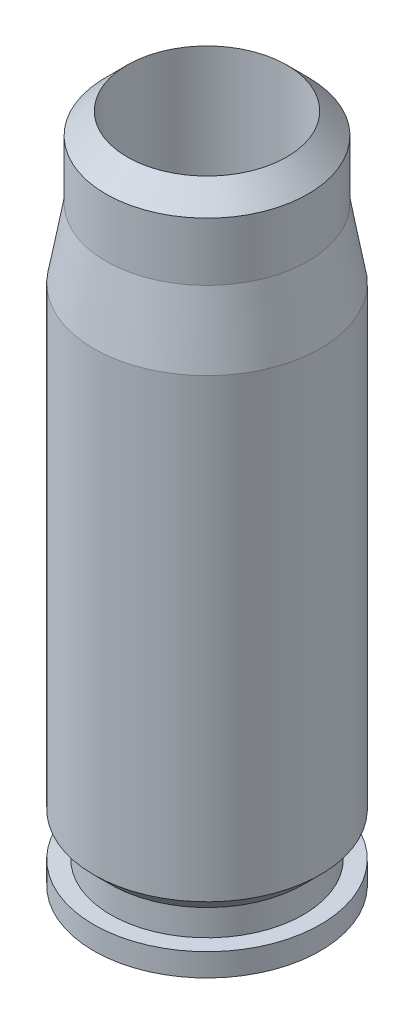
ISO-10303-21;
HEADER;
FILE_DESCRIPTION(('STEP AP214'),'2;1');
FILE_NAME('part.step','',(''),(''),'','','');
FILE_SCHEMA(('AUTOMOTIVE_DESIGN { 1 0 10303 214 1 1 1 1 }'));
ENDSEC;
DATA;
#1=APPLICATION_CONTEXT('core data for automotive mechanical design processes');
#2=APPLICATION_PROTOCOL_DEFINITION('international standard','automotive_design',2000,#1);
#3=PRODUCT_CONTEXT('',#1,'mechanical');
#4=PRODUCT('Part','Part','',(#3));
#5=PRODUCT_RELATED_PRODUCT_CATEGORY('part','',(#4));
#6=PRODUCT_DEFINITION_FORMATION('','',#4);
#7=PRODUCT_DEFINITION_CONTEXT('part definition',#1,'design');
#8=PRODUCT_DEFINITION('design','',#6,#7);
#9=PRODUCT_DEFINITION_SHAPE('','',#8);
#10=(LENGTH_UNIT() NAMED_UNIT(*) SI_UNIT(.MILLI.,.METRE.));
#11=(NAMED_UNIT(*) PLANE_ANGLE_UNIT() SI_UNIT($,.RADIAN.));
#12=(NAMED_UNIT(*) SI_UNIT($,.STERADIAN.) SOLID_ANGLE_UNIT());
#13=UNCERTAINTY_MEASURE_WITH_UNIT(LENGTH_MEASURE(1.E-05),#10,'distance_accuracy_value','');
#14=(GEOMETRIC_REPRESENTATION_CONTEXT(3) GLOBAL_UNCERTAINTY_ASSIGNED_CONTEXT((#13)) GLOBAL_UNIT_ASSIGNED_CONTEXT((#10,
#11,#12)) REPRESENTATION_CONTEXT('',''));
#15=CARTESIAN_POINT('',(0.,0.,0.));
#16=DIRECTION('',(0.,0.,1.));
#17=DIRECTION('',(1.,0.,0.));
#18=AXIS2_PLACEMENT_3D('',#15,#16,#17);
#19=CARTESIAN_POINT('',(0.,0.,0.));
#20=DIRECTION('',(0.,-1.,0.));
#21=DIRECTION('',(0.,0.,-1.));
#22=AXIS2_PLACEMENT_3D('',#19,#20,#21);
#23=CYLINDRICAL_SURFACE('',#22,4.5);
#24=CARTESIAN_POINT('',(0.,0.,0.));
#25=DIRECTION('',(0.,-1.,0.));
#26=DIRECTION('',(0.,0.,-1.));
#27=AXIS2_PLACEMENT_3D('',#24,#25,#26);
#28=CIRCLE('',#27,4.5);
#29=CARTESIAN_POINT('',(0.,0.,-4.5));
#30=VERTEX_POINT('',#29);
#31=EDGE_CURVE('E72',#30,#30,#28,.T.);
#32=ORIENTED_EDGE('',*,*,#31,.T.);
#33=EDGE_LOOP('',(#32));
#34=FACE_BOUND('',#33,.T.);
#35=CARTESIAN_POINT('',(0.,12.,0.));
#36=DIRECTION('',(0.,-1.,0.));
#37=DIRECTION('',(0.,0.,-1.));
#38=AXIS2_PLACEMENT_3D('',#35,#36,#37);
#39=CIRCLE('',#38,4.5);
#40=CARTESIAN_POINT('',(0.,12.,-4.5));
#41=VERTEX_POINT('',#40);
#42=EDGE_CURVE('E42',#41,#41,#39,.T.);
#43=ORIENTED_EDGE('',*,*,#42,.F.);
#44=EDGE_LOOP('',(#43));
#45=FACE_BOUND('',#44,.T.);
#46=ADVANCED_FACE('F31',(#34,#45),#23,.F.);
#47=CARTESIAN_POINT('',(0.,12.,-4.5));
#48=DIRECTION('',(0.,1.,0.));
#49=DIRECTION('',(0.,0.,1.));
#50=AXIS2_PLACEMENT_3D('',#47,#48,#49);
#51=PLANE('',#50);
#52=ORIENTED_EDGE('',*,*,#42,.T.);
#53=EDGE_LOOP('',(#52));
#54=FACE_BOUND('',#53,.T.);
#55=CARTESIAN_POINT('',(0.,12.,0.));
#56=DIRECTION('',(0.,-1.,0.));
#57=DIRECTION('',(0.,0.,-1.));
#58=AXIS2_PLACEMENT_3D('',#55,#56,#57);
#59=CIRCLE('',#58,7.00000000000001);
#60=CARTESIAN_POINT('',(0.,12.,-7.00000000000001));
#61=VERTEX_POINT('',#60);
#62=EDGE_CURVE('E46',#61,#61,#59,.T.);
#63=ORIENTED_EDGE('',*,*,#62,.F.);
#64=EDGE_LOOP('',(#63));
#65=FACE_BOUND('',#64,.T.);
#66=ADVANCED_FACE('F92',(#54,#65),#51,.T.);
#67=CARTESIAN_POINT('',(0.,0.,0.));
#68=DIRECTION('',(0.,-1.,0.));
#69=DIRECTION('',(0.,0.,-1.));
#70=AXIS2_PLACEMENT_3D('',#67,#68,#69);
#71=CYLINDRICAL_SURFACE('',#70,7.);
#72=CARTESIAN_POINT('',(0.,58.875,0.));
#73=DIRECTION('',(0.,-1.,0.));
#74=DIRECTION('',(0.,0.,-1.));
#75=AXIS2_PLACEMENT_3D('',#72,#73,#74);
#76=CIRCLE('',#75,7.);
#77=CARTESIAN_POINT('',(0.,58.875,-7.));
#78=VERTEX_POINT('',#77);
#79=EDGE_CURVE('E10',#78,#78,#76,.F.);
#80=ORIENTED_EDGE('',*,*,#79,.T.);
#81=EDGE_LOOP('',(#80));
#82=FACE_BOUND('',#81,.T.);
#83=ORIENTED_EDGE('',*,*,#62,.T.);
#84=EDGE_LOOP('',(#83));
#85=FACE_BOUND('',#84,.T.);
#86=ADVANCED_FACE('F96',(#82,#85),#71,.F.);
#87=CARTESIAN_POINT('',(0.,0.,0.));
#88=DIRECTION('',(0.,-1.,0.));
#89=DIRECTION('',(0.,0.,-1.));
#90=AXIS2_PLACEMENT_3D('',#87,#88,#89);
#91=CYLINDRICAL_SURFACE('',#90,8.875);
#92=CARTESIAN_POINT('',(0.,56.9999999999999,0.));
#93=DIRECTION('',(0.,1.,0.));
#94=DIRECTION('',(0.,0.,1.));
#95=AXIS2_PLACEMENT_3D('',#92,#93,#94);
#96=CIRCLE('',#95,8.875);
#97=CARTESIAN_POINT('',(0.,56.9999999999999,8.875));
#98=VERTEX_POINT('',#97);
#99=EDGE_CURVE('E38',#98,#98,#96,.F.);
#100=ORIENTED_EDGE('',*,*,#99,.T.);
#101=EDGE_LOOP('',(#100));
#102=FACE_BOUND('',#101,.T.);
#103=CARTESIAN_POINT('',(0.,51.8880146452539,0.));
#104=DIRECTION('',(0.,-1.,0.));
#105=DIRECTION('',(0.,0.,-1.));
#106=AXIS2_PLACEMENT_3D('',#103,#104,#105);
#107=CIRCLE('',#106,8.875);
#108=CARTESIAN_POINT('',(0.,51.8880146452539,-8.875));
#109=VERTEX_POINT('',#108);
#110=EDGE_CURVE('E51',#109,#109,#107,.T.);
#111=ORIENTED_EDGE('',*,*,#110,.F.);
#112=EDGE_LOOP('',(#111));
#113=FACE_BOUND('',#112,.T.);
#114=ADVANCED_FACE('F102',(#102,#113),#91,.T.);
#115=CARTESIAN_POINT('',(0.,45.7913866891649,0.));
#116=DIRECTION('',(0.,-1.,0.));
#117=DIRECTION('',(0.,0.,-1.));
#118=AXIS2_PLACEMENT_3D('',#115,#116,#117);
#119=CONICAL_SURFACE('',#118,9.95,0.174532925199434);
#120=ORIENTED_EDGE('',*,*,#110,.T.);
#121=EDGE_LOOP('',(#120));
#122=FACE_BOUND('',#121,.T.);
#123=CARTESIAN_POINT('',(0.,45.7913866891649,0.));
#124=DIRECTION('',(0.,-1.,0.));
#125=DIRECTION('',(0.,0.,-1.));
#126=AXIS2_PLACEMENT_3D('',#123,#124,#125);
#127=CIRCLE('',#126,9.95);
#128=CARTESIAN_POINT('',(0.,45.7913866891649,-9.95));
#129=VERTEX_POINT('',#128);
#130=EDGE_CURVE('E54',#129,#129,#127,.T.);
#131=ORIENTED_EDGE('',*,*,#130,.F.);
#132=EDGE_LOOP('',(#131));
#133=FACE_BOUND('',#132,.T.);
#134=ADVANCED_FACE('F105',(#122,#133),#119,.T.);
#135=CARTESIAN_POINT('',(0.,0.,0.));
#136=DIRECTION('',(0.,-1.,0.));
#137=DIRECTION('',(0.,0.,-1.));
#138=AXIS2_PLACEMENT_3D('',#135,#136,#137);
#139=CYLINDRICAL_SURFACE('',#138,9.95);
#140=ORIENTED_EDGE('',*,*,#130,.T.);
#141=EDGE_LOOP('',(#140));
#142=FACE_BOUND('',#141,.T.);
#143=CARTESIAN_POINT('',(0.,5.79138668916486,0.));
#144=DIRECTION('',(0.,-1.,0.));
#145=DIRECTION('',(0.,0.,-1.));
#146=AXIS2_PLACEMENT_3D('',#143,#144,#145);
#147=CIRCLE('',#146,9.95);
#148=CARTESIAN_POINT('',(0.,5.79138668916486,-9.95));
#149=VERTEX_POINT('',#148);
#150=EDGE_CURVE('E57',#149,#149,#147,.T.);
#151=ORIENTED_EDGE('',*,*,#150,.F.);
#152=EDGE_LOOP('',(#151));
#153=FACE_BOUND('',#152,.T.);
#154=ADVANCED_FACE('F108',(#142,#153),#139,.T.);
#155=CARTESIAN_POINT('',(0.,4.3,0.));
#156=DIRECTION('',(0.,1.,0.));
#157=DIRECTION('',(0.,0.,1.));
#158=AXIS2_PLACEMENT_3D('',#155,#156,#157);
#159=CONICAL_SURFACE('',#158,8.45861331083515,0.785398163397447);
#160=ORIENTED_EDGE('',*,*,#150,.T.);
#161=EDGE_LOOP('',(#160));
#162=FACE_BOUND('',#161,.T.);
#163=CARTESIAN_POINT('',(0.,4.3,0.));
#164=DIRECTION('',(0.,-1.,0.));
#165=DIRECTION('',(0.,0.,-1.));
#166=AXIS2_PLACEMENT_3D('',#163,#164,#165);
#167=CIRCLE('',#166,8.45861331083515);
#168=CARTESIAN_POINT('',(0.,4.3,-8.45861331083515));
#169=VERTEX_POINT('',#168);
#170=EDGE_CURVE('E60',#169,#169,#167,.T.);
#171=ORIENTED_EDGE('',*,*,#170,.F.);
#172=EDGE_LOOP('',(#171));
#173=FACE_BOUND('',#172,.T.);
#174=ADVANCED_FACE('F112',(#162,#173),#159,.T.);
#175=CARTESIAN_POINT('',(0.,0.,0.));
#176=DIRECTION('',(0.,-1.,0.));
#177=DIRECTION('',(0.,0.,-1.));
#178=AXIS2_PLACEMENT_3D('',#175,#176,#177);
#179=CYLINDRICAL_SURFACE('',#178,8.45861331083515);
#180=ORIENTED_EDGE('',*,*,#170,.T.);
#181=EDGE_LOOP('',(#180));
#182=FACE_BOUND('',#181,.T.);
#183=CARTESIAN_POINT('',(0.,2.,0.));
#184=DIRECTION('',(0.,-1.,0.));
#185=DIRECTION('',(0.,0.,-1.));
#186=AXIS2_PLACEMENT_3D('',#183,#184,#185);
#187=CIRCLE('',#186,8.45861331083515);
#188=CARTESIAN_POINT('',(0.,2.,-8.45861331083515));
#189=VERTEX_POINT('',#188);
#190=EDGE_CURVE('E63',#189,#189,#187,.T.);
#191=ORIENTED_EDGE('',*,*,#190,.F.);
#192=EDGE_LOOP('',(#191));
#193=FACE_BOUND('',#192,.T.);
#194=ADVANCED_FACE('F116',(#182,#193),#179,.T.);
#195=CARTESIAN_POINT('',(0.,2.,-9.95));
#196=DIRECTION('',(0.,1.,0.));
#197=DIRECTION('',(0.,0.,1.));
#198=AXIS2_PLACEMENT_3D('',#195,#196,#197);
#199=PLANE('',#198);
#200=ORIENTED_EDGE('',*,*,#190,.T.);
#201=EDGE_LOOP('',(#200));
#202=FACE_BOUND('',#201,.T.);
#203=CARTESIAN_POINT('',(0.,2.,0.));
#204=DIRECTION('',(0.,-1.,0.));
#205=DIRECTION('',(0.,0.,-1.));
#206=AXIS2_PLACEMENT_3D('',#203,#204,#205);
#207=CIRCLE('',#206,9.95);
#208=CARTESIAN_POINT('',(0.,2.,-9.95));
#209=VERTEX_POINT('',#208);
#210=EDGE_CURVE('E66',#209,#209,#207,.T.);
#211=ORIENTED_EDGE('',*,*,#210,.F.);
#212=EDGE_LOOP('',(#211));
#213=FACE_BOUND('',#212,.T.);
#214=ADVANCED_FACE('F88',(#202,#213),#199,.T.);
#215=CARTESIAN_POINT('',(0.,0.,0.));
#216=DIRECTION('',(0.,-1.,0.));
#217=DIRECTION('',(0.,0.,-1.));
#218=AXIS2_PLACEMENT_3D('',#215,#216,#217);
#219=CYLINDRICAL_SURFACE('',#218,9.95);
#220=ORIENTED_EDGE('',*,*,#210,.T.);
#221=EDGE_LOOP('',(#220));
#222=FACE_BOUND('',#221,.T.);
#223=CARTESIAN_POINT('',(0.,0.,0.));
#224=DIRECTION('',(0.,-1.,0.));
#225=DIRECTION('',(0.,0.,-1.));
#226=AXIS2_PLACEMENT_3D('',#223,#224,#225);
#227=CIRCLE('',#226,9.95);
#228=CARTESIAN_POINT('',(0.,0.,-9.95));
#229=VERTEX_POINT('',#228);
#230=EDGE_CURVE('E69',#229,#229,#227,.T.);
#231=ORIENTED_EDGE('',*,*,#230,.F.);
#232=EDGE_LOOP('',(#231));
#233=FACE_BOUND('',#232,.T.);
#234=ADVANCED_FACE('F80',(#222,#233),#219,.T.);
#235=CARTESIAN_POINT('',(0.,0.,-4.5));
#236=DIRECTION('',(0.,-1.,0.));
#237=DIRECTION('',(0.,0.,-1.));
#238=AXIS2_PLACEMENT_3D('',#235,#236,#237);
#239=PLANE('',#238);
#240=ORIENTED_EDGE('',*,*,#230,.T.);
#241=EDGE_LOOP('',(#240));
#242=FACE_BOUND('',#241,.T.);
#243=ORIENTED_EDGE('',*,*,#31,.F.);
#244=EDGE_LOOP('',(#243));
#245=FACE_BOUND('',#244,.T.);
#246=ADVANCED_FACE('F78',(#242,#245),#239,.T.);
#247=CARTESIAN_POINT('',(0.,56.9999999999999,0.));
#248=DIRECTION('',(0.,-1.,0.));
#249=DIRECTION('',(0.,0.,-1.));
#250=AXIS2_PLACEMENT_3D('',#247,#248,#249);
#251=CONICAL_SURFACE('',#250,8.875,0.785398163397443);
#252=ORIENTED_EDGE('',*,*,#79,.F.);
#253=EDGE_LOOP('',(#252));
#254=FACE_BOUND('',#253,.T.);
#255=ORIENTED_EDGE('',*,*,#99,.F.);
#256=EDGE_LOOP('',(#255));
#257=FACE_BOUND('',#256,.T.);
#258=ADVANCED_FACE('F33',(#254,#257),#251,.T.);
#259=CLOSED_SHELL('',(#46,#66,#86,#114,#134,#154,#174,#194,#214,#234,#246,#258));
#260=MANIFOLD_SOLID_BREP('B2',#259);
#261=ADVANCED_BREP_SHAPE_REPRESENTATION('',(#18,#260),#14);
#262=SHAPE_DEFINITION_REPRESENTATION(#9,#261);
ENDSEC;
END-ISO-10303-21;
